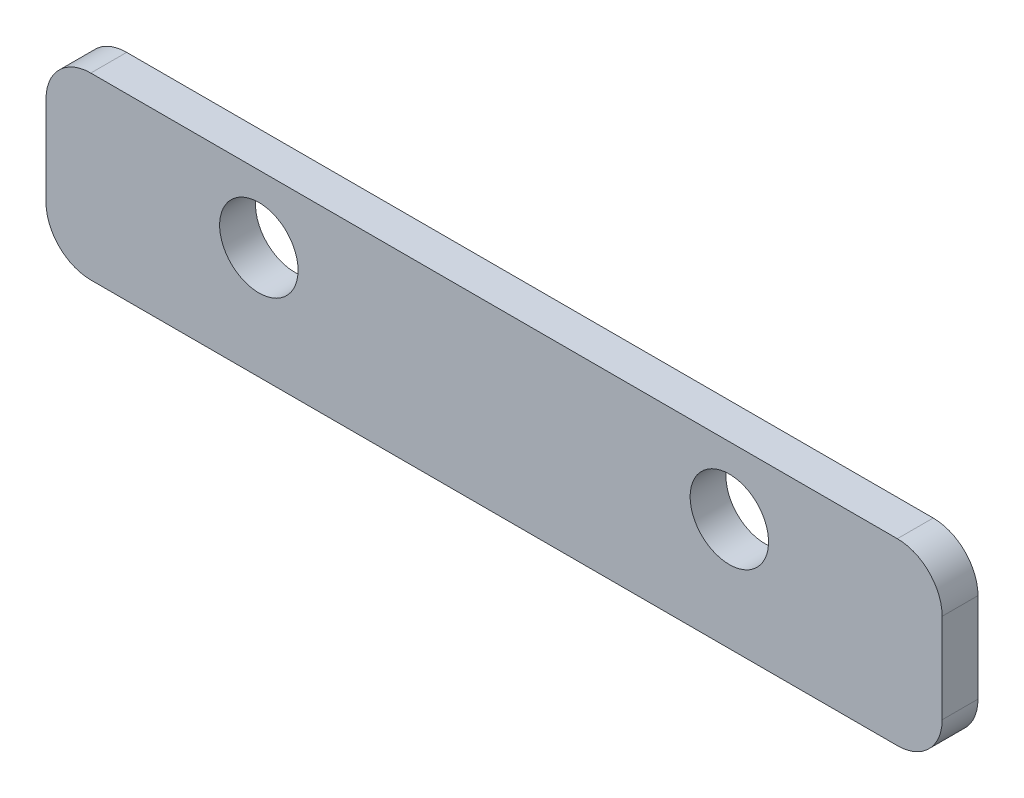
ISO-10303-21;
HEADER;
FILE_DESCRIPTION(('STEP AP214'),'2;1');
FILE_NAME('part.step','',(''),(''),'','','');
FILE_SCHEMA(('AUTOMOTIVE_DESIGN { 1 0 10303 214 1 1 1 1 }'));
ENDSEC;
DATA;
#1=APPLICATION_CONTEXT('core data for automotive mechanical design processes');
#2=APPLICATION_PROTOCOL_DEFINITION('international standard','automotive_design',2000,#1);
#3=PRODUCT_CONTEXT('',#1,'mechanical');
#4=PRODUCT('Part','Part','',(#3));
#5=PRODUCT_RELATED_PRODUCT_CATEGORY('part','',(#4));
#6=PRODUCT_DEFINITION_FORMATION('','',#4);
#7=PRODUCT_DEFINITION_CONTEXT('part definition',#1,'design');
#8=PRODUCT_DEFINITION('design','',#6,#7);
#9=PRODUCT_DEFINITION_SHAPE('','',#8);
#10=(LENGTH_UNIT() NAMED_UNIT(*) SI_UNIT(.MILLI.,.METRE.));
#11=(NAMED_UNIT(*) PLANE_ANGLE_UNIT() SI_UNIT($,.RADIAN.));
#12=(NAMED_UNIT(*) SI_UNIT($,.STERADIAN.) SOLID_ANGLE_UNIT());
#13=UNCERTAINTY_MEASURE_WITH_UNIT(LENGTH_MEASURE(1.E-05),#10,'distance_accuracy_value','');
#14=(GEOMETRIC_REPRESENTATION_CONTEXT(3) GLOBAL_UNCERTAINTY_ASSIGNED_CONTEXT((#13)) GLOBAL_UNIT_ASSIGNED_CONTEXT((#10,
#11,#12)) REPRESENTATION_CONTEXT('',''));
#15=CARTESIAN_POINT('',(0.,0.,0.));
#16=DIRECTION('',(0.,0.,1.));
#17=DIRECTION('',(1.,0.,0.));
#18=AXIS2_PLACEMENT_3D('',#15,#16,#17);
#19=CARTESIAN_POINT('',(-18.,2.,1.6));
#20=DIRECTION('',(0.,0.,-1.));
#21=DIRECTION('',(-1.,0.,0.));
#22=AXIS2_PLACEMENT_3D('',#19,#20,#21);
#23=PLANE('',#22);
#24=CARTESIAN_POINT('',(10.5,1.,1.6));
#25=DIRECTION('',(0.,0.,-1.));
#26=DIRECTION('',(-1.,0.,0.));
#27=AXIS2_PLACEMENT_3D('',#24,#25,#26);
#28=CIRCLE('',#27,1.75);
#29=CARTESIAN_POINT('',(8.75000000000003,1.,1.6));
#30=VERTEX_POINT('',#29);
#31=EDGE_CURVE('E271',#30,#30,#28,.T.);
#32=ORIENTED_EDGE('',*,*,#31,.T.);
#33=EDGE_LOOP('',(#32));
#34=FACE_BOUND('',#33,.T.);
#35=CARTESIAN_POINT('',(-18.,2.,1.6));
#36=DIRECTION('',(0.,0.,-1.));
#37=DIRECTION('',(-1.,0.,0.));
#38=AXIS2_PLACEMENT_3D('',#35,#36,#37);
#39=CIRCLE('',#38,2.);
#40=CARTESIAN_POINT('',(-20.,1.99999999999999,1.6));
#41=VERTEX_POINT('',#40);
#42=CARTESIAN_POINT('',(-18.,4.,1.6));
#43=VERTEX_POINT('',#42);
#44=EDGE_CURVE('E220',#41,#43,#39,.T.);
#45=ORIENTED_EDGE('',*,*,#44,.F.);
#46=DIRECTION('',(0.,1.,0.));
#47=VECTOR('',#46,1.);
#48=CARTESIAN_POINT('',(-20.,-1.99999999999998,1.6));
#49=LINE('',#48,#47);
#50=CARTESIAN_POINT('',(-20.,-2.,1.6));
#51=VERTEX_POINT('',#50);
#52=EDGE_CURVE('E186',#51,#41,#49,.T.);
#53=ORIENTED_EDGE('',*,*,#52,.F.);
#54=CARTESIAN_POINT('',(-18.,-2.,1.6));
#55=DIRECTION('',(0.,0.,-1.));
#56=DIRECTION('',(-1.,0.,0.));
#57=AXIS2_PLACEMENT_3D('',#54,#55,#56);
#58=CIRCLE('',#57,2.);
#59=CARTESIAN_POINT('',(-18.,-4.,1.6));
#60=VERTEX_POINT('',#59);
#61=EDGE_CURVE('E168',#60,#51,#58,.T.);
#62=ORIENTED_EDGE('',*,*,#61,.F.);
#63=DIRECTION('',(1.,0.,0.));
#64=VECTOR('',#63,1.);
#65=CARTESIAN_POINT('',(-18.,-4.,1.6));
#66=LINE('',#65,#64);
#67=CARTESIAN_POINT('',(18.,-4.,1.6));
#68=VERTEX_POINT('',#67);
#69=EDGE_CURVE('E177',#60,#68,#66,.T.);
#70=ORIENTED_EDGE('',*,*,#69,.T.);
#71=CARTESIAN_POINT('',(18.,-2.,1.6));
#72=DIRECTION('',(0.,0.,1.));
#73=DIRECTION('',(1.,0.,0.));
#74=AXIS2_PLACEMENT_3D('',#71,#72,#73);
#75=CIRCLE('',#74,2.);
#76=CARTESIAN_POINT('',(20.,-1.99999999999998,1.6));
#77=VERTEX_POINT('',#76);
#78=EDGE_CURVE('E183',#68,#77,#75,.T.);
#79=ORIENTED_EDGE('',*,*,#78,.T.);
#80=DIRECTION('',(0.,1.,0.));
#81=VECTOR('',#80,1.);
#82=CARTESIAN_POINT('',(20.,-1.99999999999998,1.6));
#83=LINE('',#82,#81);
#84=CARTESIAN_POINT('',(20.,1.99999999999999,1.6));
#85=VERTEX_POINT('',#84);
#86=EDGE_CURVE('E295',#77,#85,#83,.T.);
#87=ORIENTED_EDGE('',*,*,#86,.T.);
#88=CARTESIAN_POINT('',(18.,2.,1.6));
#89=DIRECTION('',(0.,0.,1.));
#90=DIRECTION('',(1.,0.,0.));
#91=AXIS2_PLACEMENT_3D('',#88,#89,#90);
#92=CIRCLE('',#91,2.);
#93=CARTESIAN_POINT('',(18.,4.,1.6));
#94=VERTEX_POINT('',#93);
#95=EDGE_CURVE('E292',#85,#94,#92,.T.);
#96=ORIENTED_EDGE('',*,*,#95,.T.);
#97=DIRECTION('',(1.,0.,0.));
#98=VECTOR('',#97,1.);
#99=CARTESIAN_POINT('',(-18.,4.,1.6));
#100=LINE('',#99,#98);
#101=EDGE_CURVE('E289',#43,#94,#100,.T.);
#102=ORIENTED_EDGE('',*,*,#101,.F.);
#103=EDGE_LOOP('',(#45,#53,#62,#70,#79,#87,#96,#102));
#104=FACE_BOUND('',#103,.T.);
#105=CARTESIAN_POINT('',(-10.5,1.,1.6));
#106=DIRECTION('',(0.,0.,1.));
#107=DIRECTION('',(1.,0.,0.));
#108=AXIS2_PLACEMENT_3D('',#105,#106,#107);
#109=CIRCLE('',#108,1.75);
#110=CARTESIAN_POINT('',(-8.75,1.,1.6));
#111=VERTEX_POINT('',#110);
#112=EDGE_CURVE('E198',#111,#111,#109,.T.);
#113=ORIENTED_EDGE('',*,*,#112,.F.);
#114=EDGE_LOOP('',(#113));
#115=FACE_BOUND('',#114,.T.);
#116=ADVANCED_FACE('F93',(#34,#104,#115),#23,.F.);
#117=CARTESIAN_POINT('',(-18.,2.,0.));
#118=DIRECTION('',(0.,0.,-1.));
#119=DIRECTION('',(-1.,0.,0.));
#120=AXIS2_PLACEMENT_3D('',#117,#118,#119);
#121=PLANE('',#120);
#122=CARTESIAN_POINT('',(10.5,1.,0.));
#123=DIRECTION('',(0.,0.,-1.));
#124=DIRECTION('',(-1.,0.,0.));
#125=AXIS2_PLACEMENT_3D('',#122,#123,#124);
#126=CIRCLE('',#125,1.75);
#127=CARTESIAN_POINT('',(8.75000000000003,1.,0.));
#128=VERTEX_POINT('',#127);
#129=EDGE_CURVE('E274',#128,#128,#126,.T.);
#130=ORIENTED_EDGE('',*,*,#129,.F.);
#131=EDGE_LOOP('',(#130));
#132=FACE_BOUND('',#131,.T.);
#133=CARTESIAN_POINT('',(-18.,2.,0.));
#134=DIRECTION('',(0.,0.,-1.));
#135=DIRECTION('',(-1.,0.,0.));
#136=AXIS2_PLACEMENT_3D('',#133,#134,#135);
#137=CIRCLE('',#136,2.);
#138=CARTESIAN_POINT('',(-20.,1.99999999999999,0.));
#139=VERTEX_POINT('',#138);
#140=CARTESIAN_POINT('',(-18.,4.,0.));
#141=VERTEX_POINT('',#140);
#142=EDGE_CURVE('E193',#139,#141,#137,.T.);
#143=ORIENTED_EDGE('',*,*,#142,.T.);
#144=DIRECTION('',(1.,0.,0.));
#145=VECTOR('',#144,1.);
#146=CARTESIAN_POINT('',(-18.,4.,0.));
#147=LINE('',#146,#145);
#148=CARTESIAN_POINT('',(18.,4.,0.));
#149=VERTEX_POINT('',#148);
#150=EDGE_CURVE('E197',#141,#149,#147,.T.);
#151=ORIENTED_EDGE('',*,*,#150,.T.);
#152=CARTESIAN_POINT('',(18.,2.,0.));
#153=DIRECTION('',(0.,0.,1.));
#154=DIRECTION('',(1.,0.,0.));
#155=AXIS2_PLACEMENT_3D('',#152,#153,#154);
#156=CIRCLE('',#155,2.);
#157=CARTESIAN_POINT('',(20.,1.99999999999999,0.));
#158=VERTEX_POINT('',#157);
#159=EDGE_CURVE('E202',#158,#149,#156,.T.);
#160=ORIENTED_EDGE('',*,*,#159,.F.);
#161=DIRECTION('',(0.,1.,0.));
#162=VECTOR('',#161,1.);
#163=CARTESIAN_POINT('',(20.,-1.99999999999998,0.));
#164=LINE('',#163,#162);
#165=CARTESIAN_POINT('',(20.,-1.99999999999998,0.));
#166=VERTEX_POINT('',#165);
#167=EDGE_CURVE('E206',#166,#158,#164,.T.);
#168=ORIENTED_EDGE('',*,*,#167,.F.);
#169=CARTESIAN_POINT('',(18.,-2.,0.));
#170=DIRECTION('',(0.,0.,1.));
#171=DIRECTION('',(1.,0.,0.));
#172=AXIS2_PLACEMENT_3D('',#169,#170,#171);
#173=CIRCLE('',#172,2.);
#174=CARTESIAN_POINT('',(18.,-4.,0.));
#175=VERTEX_POINT('',#174);
#176=EDGE_CURVE('E209',#175,#166,#173,.T.);
#177=ORIENTED_EDGE('',*,*,#176,.F.);
#178=DIRECTION('',(1.,0.,0.));
#179=VECTOR('',#178,1.);
#180=CARTESIAN_POINT('',(-18.,-4.,0.));
#181=LINE('',#180,#179);
#182=CARTESIAN_POINT('',(-18.,-4.,0.));
#183=VERTEX_POINT('',#182);
#184=EDGE_CURVE('E212',#183,#175,#181,.T.);
#185=ORIENTED_EDGE('',*,*,#184,.F.);
#186=CARTESIAN_POINT('',(-18.,-2.,0.));
#187=DIRECTION('',(0.,0.,-1.));
#188=DIRECTION('',(-1.,0.,0.));
#189=AXIS2_PLACEMENT_3D('',#186,#187,#188);
#190=CIRCLE('',#189,2.);
#191=CARTESIAN_POINT('',(-20.,-2.,0.));
#192=VERTEX_POINT('',#191);
#193=EDGE_CURVE('E170',#183,#192,#190,.T.);
#194=ORIENTED_EDGE('',*,*,#193,.T.);
#195=DIRECTION('',(0.,1.,0.));
#196=VECTOR('',#195,1.);
#197=CARTESIAN_POINT('',(-20.,-1.99999999999998,0.));
#198=LINE('',#197,#196);
#199=EDGE_CURVE('E217',#192,#139,#198,.T.);
#200=ORIENTED_EDGE('',*,*,#199,.T.);
#201=EDGE_LOOP('',(#143,#151,#160,#168,#177,#185,#194,#200));
#202=FACE_BOUND('',#201,.T.);
#203=CARTESIAN_POINT('',(-10.5,1.,0.));
#204=DIRECTION('',(0.,0.,1.));
#205=DIRECTION('',(1.,0.,0.));
#206=AXIS2_PLACEMENT_3D('',#203,#204,#205);
#207=CIRCLE('',#206,1.75);
#208=CARTESIAN_POINT('',(-8.75,1.,0.));
#209=VERTEX_POINT('',#208);
#210=EDGE_CURVE('E278',#209,#209,#207,.T.);
#211=ORIENTED_EDGE('',*,*,#210,.T.);
#212=EDGE_LOOP('',(#211));
#213=FACE_BOUND('',#212,.T.);
#214=ADVANCED_FACE('F240',(#132,#202,#213),#121,.T.);
#215=CARTESIAN_POINT('',(-18.,2.,1.6));
#216=DIRECTION('',(0.,0.,-1.));
#217=DIRECTION('',(-1.,0.,0.));
#218=AXIS2_PLACEMENT_3D('',#215,#216,#217);
#219=CYLINDRICAL_SURFACE('',#218,2.);
#220=ORIENTED_EDGE('',*,*,#142,.F.);
#221=DIRECTION('',(0.,0.,-1.));
#222=VECTOR('',#221,1.);
#223=CARTESIAN_POINT('',(-20.,1.99999999999999,1.6));
#224=LINE('',#223,#222);
#225=EDGE_CURVE('E12',#41,#139,#224,.T.);
#226=ORIENTED_EDGE('',*,*,#225,.F.);
#227=ORIENTED_EDGE('',*,*,#44,.T.);
#228=DIRECTION('',(0.,0.,-1.));
#229=VECTOR('',#228,1.);
#230=CARTESIAN_POINT('',(-18.,4.,1.6));
#231=LINE('',#230,#229);
#232=EDGE_CURVE('E97',#43,#141,#231,.T.);
#233=ORIENTED_EDGE('',*,*,#232,.T.);
#234=EDGE_LOOP('',(#220,#226,#227,#233));
#235=FACE_BOUND('',#234,.T.);
#236=ADVANCED_FACE('F95',(#235),#219,.T.);
#237=CARTESIAN_POINT('',(-20.,-1.99999999999998,1.6));
#238=DIRECTION('',(-1.,0.,0.));
#239=DIRECTION('',(0.,0.,1.));
#240=AXIS2_PLACEMENT_3D('',#237,#238,#239);
#241=PLANE('',#240);
#242=ORIENTED_EDGE('',*,*,#199,.F.);
#243=DIRECTION('',(0.,0.,-1.));
#244=VECTOR('',#243,1.);
#245=CARTESIAN_POINT('',(-20.,-2.,1.6));
#246=LINE('',#245,#244);
#247=EDGE_CURVE('E104',#51,#192,#246,.T.);
#248=ORIENTED_EDGE('',*,*,#247,.F.);
#249=ORIENTED_EDGE('',*,*,#52,.T.);
#250=ORIENTED_EDGE('',*,*,#225,.T.);
#251=EDGE_LOOP('',(#242,#248,#249,#250));
#252=FACE_BOUND('',#251,.T.);
#253=ADVANCED_FACE('F242',(#252),#241,.T.);
#254=CARTESIAN_POINT('',(-18.,-2.,1.6));
#255=DIRECTION('',(0.,0.,-1.));
#256=DIRECTION('',(-1.,0.,0.));
#257=AXIS2_PLACEMENT_3D('',#254,#255,#256);
#258=CYLINDRICAL_SURFACE('',#257,2.);
#259=ORIENTED_EDGE('',*,*,#193,.F.);
#260=DIRECTION('',(0.,0.,-1.));
#261=VECTOR('',#260,1.);
#262=CARTESIAN_POINT('',(-18.,-4.,1.6));
#263=LINE('',#262,#261);
#264=EDGE_CURVE('E164',#60,#183,#263,.T.);
#265=ORIENTED_EDGE('',*,*,#264,.F.);
#266=ORIENTED_EDGE('',*,*,#61,.T.);
#267=ORIENTED_EDGE('',*,*,#247,.T.);
#268=EDGE_LOOP('',(#259,#265,#266,#267));
#269=FACE_BOUND('',#268,.T.);
#270=ADVANCED_FACE('F166',(#269),#258,.T.);
#271=CARTESIAN_POINT('',(-18.,-4.,1.6));
#272=DIRECTION('',(0.,1.,0.));
#273=DIRECTION('',(0.,0.,1.));
#274=AXIS2_PLACEMENT_3D('',#271,#272,#273);
#275=PLANE('',#274);
#276=ORIENTED_EDGE('',*,*,#184,.T.);
#277=DIRECTION('',(0.,0.,-1.));
#278=VECTOR('',#277,1.);
#279=CARTESIAN_POINT('',(18.,-4.,1.6));
#280=LINE('',#279,#278);
#281=EDGE_CURVE('E174',#68,#175,#280,.T.);
#282=ORIENTED_EDGE('',*,*,#281,.F.);
#283=ORIENTED_EDGE('',*,*,#69,.F.);
#284=ORIENTED_EDGE('',*,*,#264,.T.);
#285=EDGE_LOOP('',(#276,#282,#283,#284));
#286=FACE_BOUND('',#285,.T.);
#287=ADVANCED_FACE('F178',(#286),#275,.F.);
#288=CARTESIAN_POINT('',(18.,-2.,1.6));
#289=DIRECTION('',(0.,0.,-1.));
#290=DIRECTION('',(-1.,0.,0.));
#291=AXIS2_PLACEMENT_3D('',#288,#289,#290);
#292=CYLINDRICAL_SURFACE('',#291,2.);
#293=ORIENTED_EDGE('',*,*,#176,.T.);
#294=DIRECTION('',(0.,0.,-1.));
#295=VECTOR('',#294,1.);
#296=CARTESIAN_POINT('',(20.,-1.99999999999998,1.6));
#297=LINE('',#296,#295);
#298=EDGE_CURVE('E226',#77,#166,#297,.T.);
#299=ORIENTED_EDGE('',*,*,#298,.F.);
#300=ORIENTED_EDGE('',*,*,#78,.F.);
#301=ORIENTED_EDGE('',*,*,#281,.T.);
#302=EDGE_LOOP('',(#293,#299,#300,#301));
#303=FACE_BOUND('',#302,.T.);
#304=ADVANCED_FACE('F302',(#303),#292,.T.);
#305=CARTESIAN_POINT('',(20.,-1.99999999999998,1.6));
#306=DIRECTION('',(-1.,0.,0.));
#307=DIRECTION('',(0.,0.,1.));
#308=AXIS2_PLACEMENT_3D('',#305,#306,#307);
#309=PLANE('',#308);
#310=ORIENTED_EDGE('',*,*,#167,.T.);
#311=DIRECTION('',(0.,0.,-1.));
#312=VECTOR('',#311,1.);
#313=CARTESIAN_POINT('',(20.,1.99999999999999,1.6));
#314=LINE('',#313,#312);
#315=EDGE_CURVE('E230',#85,#158,#314,.T.);
#316=ORIENTED_EDGE('',*,*,#315,.F.);
#317=ORIENTED_EDGE('',*,*,#86,.F.);
#318=ORIENTED_EDGE('',*,*,#298,.T.);
#319=EDGE_LOOP('',(#310,#316,#317,#318));
#320=FACE_BOUND('',#319,.T.);
#321=ADVANCED_FACE('F306',(#320),#309,.F.);
#322=CARTESIAN_POINT('',(18.,2.,1.6));
#323=DIRECTION('',(0.,0.,-1.));
#324=DIRECTION('',(-1.,0.,0.));
#325=AXIS2_PLACEMENT_3D('',#322,#323,#324);
#326=CYLINDRICAL_SURFACE('',#325,2.);
#327=ORIENTED_EDGE('',*,*,#159,.T.);
#328=DIRECTION('',(0.,0.,-1.));
#329=VECTOR('',#328,1.);
#330=CARTESIAN_POINT('',(18.,4.,1.6));
#331=LINE('',#330,#329);
#332=EDGE_CURVE('E233',#94,#149,#331,.T.);
#333=ORIENTED_EDGE('',*,*,#332,.F.);
#334=ORIENTED_EDGE('',*,*,#95,.F.);
#335=ORIENTED_EDGE('',*,*,#315,.T.);
#336=EDGE_LOOP('',(#327,#333,#334,#335));
#337=FACE_BOUND('',#336,.T.);
#338=ADVANCED_FACE('F309',(#337),#326,.T.);
#339=CARTESIAN_POINT('',(-18.,4.,1.6));
#340=DIRECTION('',(0.,1.,0.));
#341=DIRECTION('',(0.,0.,1.));
#342=AXIS2_PLACEMENT_3D('',#339,#340,#341);
#343=PLANE('',#342);
#344=ORIENTED_EDGE('',*,*,#150,.F.);
#345=ORIENTED_EDGE('',*,*,#232,.F.);
#346=ORIENTED_EDGE('',*,*,#101,.T.);
#347=ORIENTED_EDGE('',*,*,#332,.T.);
#348=EDGE_LOOP('',(#344,#345,#346,#347));
#349=FACE_BOUND('',#348,.T.);
#350=ADVANCED_FACE('F237',(#349),#343,.T.);
#351=CARTESIAN_POINT('',(-10.5,1.,1.6));
#352=DIRECTION('',(0.,0.,-1.));
#353=DIRECTION('',(-1.,0.,0.));
#354=AXIS2_PLACEMENT_3D('',#351,#352,#353);
#355=CYLINDRICAL_SURFACE('',#354,1.75);
#356=ORIENTED_EDGE('',*,*,#112,.T.);
#357=EDGE_LOOP('',(#356));
#358=FACE_BOUND('',#357,.T.);
#359=ORIENTED_EDGE('',*,*,#210,.F.);
#360=EDGE_LOOP('',(#359));
#361=FACE_BOUND('',#360,.T.);
#362=ADVANCED_FACE('F260',(#358,#361),#355,.F.);
#363=CARTESIAN_POINT('',(10.5,1.,1.6));
#364=DIRECTION('',(0.,0.,-1.));
#365=DIRECTION('',(-1.,0.,0.));
#366=AXIS2_PLACEMENT_3D('',#363,#364,#365);
#367=CYLINDRICAL_SURFACE('',#366,1.75);
#368=ORIENTED_EDGE('',*,*,#31,.F.);
#369=EDGE_LOOP('',(#368));
#370=FACE_BOUND('',#369,.T.);
#371=ORIENTED_EDGE('',*,*,#129,.T.);
#372=EDGE_LOOP('',(#371));
#373=FACE_BOUND('',#372,.T.);
#374=ADVANCED_FACE('F263',(#370,#373),#367,.F.);
#375=CLOSED_SHELL('',(#116,#214,#236,#253,#270,#287,#304,#321,#338,#350,#362,#374));
#376=MANIFOLD_SOLID_BREP('B2',#375);
#377=ADVANCED_BREP_SHAPE_REPRESENTATION('',(#18,#376),#14);
#378=SHAPE_DEFINITION_REPRESENTATION(#9,#377);
ENDSEC;
END-ISO-10303-21;
